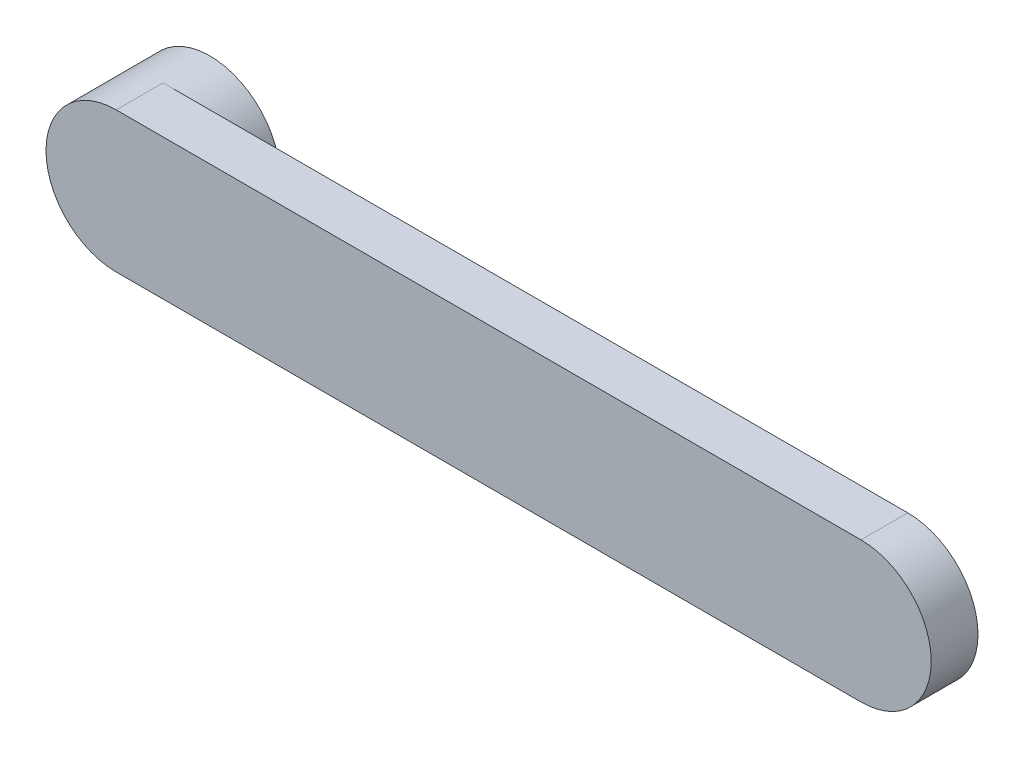
ISO-10303-21;
HEADER;
FILE_DESCRIPTION(('STEP AP214'),'2;1');
FILE_NAME('part.step','',(''),(''),'','','');
FILE_SCHEMA(('AUTOMOTIVE_DESIGN { 1 0 10303 214 1 1 1 1 }'));
ENDSEC;
DATA;
#1=APPLICATION_CONTEXT('core data for automotive mechanical design processes');
#2=APPLICATION_PROTOCOL_DEFINITION('international standard','automotive_design',2000,#1);
#3=PRODUCT_CONTEXT('',#1,'mechanical');
#4=PRODUCT('Part','Part','',(#3));
#5=PRODUCT_RELATED_PRODUCT_CATEGORY('part','',(#4));
#6=PRODUCT_DEFINITION_FORMATION('','',#4);
#7=PRODUCT_DEFINITION_CONTEXT('part definition',#1,'design');
#8=PRODUCT_DEFINITION('design','',#6,#7);
#9=PRODUCT_DEFINITION_SHAPE('','',#8);
#10=(LENGTH_UNIT() NAMED_UNIT(*) SI_UNIT(.MILLI.,.METRE.));
#11=(NAMED_UNIT(*) PLANE_ANGLE_UNIT() SI_UNIT($,.RADIAN.));
#12=(NAMED_UNIT(*) SI_UNIT($,.STERADIAN.) SOLID_ANGLE_UNIT());
#13=UNCERTAINTY_MEASURE_WITH_UNIT(LENGTH_MEASURE(1.E-05),#10,'distance_accuracy_value','');
#14=(GEOMETRIC_REPRESENTATION_CONTEXT(3) GLOBAL_UNCERTAINTY_ASSIGNED_CONTEXT((#13)) GLOBAL_UNIT_ASSIGNED_CONTEXT((#10,
#11,#12)) REPRESENTATION_CONTEXT('',''));
#15=CARTESIAN_POINT('',(0.,0.,0.));
#16=DIRECTION('',(0.,0.,1.));
#17=DIRECTION('',(1.,0.,0.));
#18=AXIS2_PLACEMENT_3D('',#15,#16,#17);
#19=CARTESIAN_POINT('',(-159.099025766973,0.,-10.));
#20=DIRECTION('',(0.,0.,1.));
#21=DIRECTION('',(1.,0.,0.));
#22=AXIS2_PLACEMENT_3D('',#19,#20,#21);
#23=CYLINDRICAL_SURFACE('',#22,30.);
#24=CARTESIAN_POINT('',(-159.099025766973,0.,10.));
#25=DIRECTION('',(0.,0.,1.));
#26=DIRECTION('',(1.,0.,0.));
#27=AXIS2_PLACEMENT_3D('',#24,#25,#26);
#28=CIRCLE('',#27,30.);
#29=CARTESIAN_POINT('',(-159.099025766973,30.,10.));
#30=VERTEX_POINT('',#29);
#31=CARTESIAN_POINT('',(-159.099025766973,-30.,10.));
#32=VERTEX_POINT('',#31);
#33=EDGE_CURVE('E104',#30,#32,#28,.T.);
#34=ORIENTED_EDGE('',*,*,#33,.F.);
#35=DIRECTION('',(0.,0.,1.));
#36=VECTOR('',#35,1.);
#37=CARTESIAN_POINT('',(-159.099025766973,30.,-10.));
#38=LINE('',#37,#36);
#39=CARTESIAN_POINT('',(-159.099025766973,30.,-10.));
#40=VERTEX_POINT('',#39);
#41=EDGE_CURVE('E40',#40,#30,#38,.T.);
#42=ORIENTED_EDGE('',*,*,#41,.F.);
#43=CARTESIAN_POINT('',(-159.099025766973,0.,-10.));
#44=DIRECTION('',(0.,0.,1.));
#45=DIRECTION('',(1.,0.,0.));
#46=AXIS2_PLACEMENT_3D('',#43,#44,#45);
#47=CIRCLE('',#46,30.);
#48=CARTESIAN_POINT('',(-159.099025766973,-30.,-10.));
#49=VERTEX_POINT('',#48);
#50=EDGE_CURVE('E11',#49,#40,#47,.T.);
#51=ORIENTED_EDGE('',*,*,#50,.F.);
#52=DIRECTION('',(0.,0.,1.));
#53=VECTOR('',#52,1.);
#54=CARTESIAN_POINT('',(-159.099025766973,-30.,-10.));
#55=LINE('',#54,#53);
#56=EDGE_CURVE('E74',#49,#32,#55,.T.);
#57=ORIENTED_EDGE('',*,*,#56,.T.);
#58=EDGE_LOOP('',(#34,#42,#51,#57));
#59=FACE_BOUND('',#58,.T.);
#60=CARTESIAN_POINT('',(-159.099025766973,0.,-30.));
#61=DIRECTION('',(0.,0.,1.));
#62=DIRECTION('',(1.,0.,0.));
#63=AXIS2_PLACEMENT_3D('',#60,#61,#62);
#64=CIRCLE('',#63,30.);
#65=CARTESIAN_POINT('',(-129.099025766973,0.,-30.));
#66=VERTEX_POINT('',#65);
#67=EDGE_CURVE('E109',#66,#66,#64,.T.);
#68=ORIENTED_EDGE('',*,*,#67,.T.);
#69=EDGE_LOOP('',(#68));
#70=FACE_BOUND('',#69,.T.);
#71=ADVANCED_FACE('F33',(#59,#70),#23,.T.);
#72=CARTESIAN_POINT('',(159.099025766973,30.,-10.));
#73=DIRECTION('',(0.,1.,0.));
#74=DIRECTION('',(0.,0.,1.));
#75=AXIS2_PLACEMENT_3D('',#72,#73,#74);
#76=PLANE('',#75);
#77=ORIENTED_EDGE('',*,*,#41,.T.);
#78=DIRECTION('',(-1.,0.,0.));
#79=VECTOR('',#78,1.);
#80=CARTESIAN_POINT('',(159.099025766973,30.,10.));
#81=LINE('',#80,#79);
#82=CARTESIAN_POINT('',(159.099025766973,30.,10.));
#83=VERTEX_POINT('',#82);
#84=EDGE_CURVE('E88',#83,#30,#81,.T.);
#85=ORIENTED_EDGE('',*,*,#84,.F.);
#86=DIRECTION('',(0.,0.,1.));
#87=VECTOR('',#86,1.);
#88=CARTESIAN_POINT('',(159.099025766973,30.,-10.));
#89=LINE('',#88,#87);
#90=CARTESIAN_POINT('',(159.099025766973,30.,-10.));
#91=VERTEX_POINT('',#90);
#92=EDGE_CURVE('E53',#91,#83,#89,.T.);
#93=ORIENTED_EDGE('',*,*,#92,.F.);
#94=DIRECTION('',(-1.,0.,0.));
#95=VECTOR('',#94,1.);
#96=CARTESIAN_POINT('',(159.099025766973,30.,-10.));
#97=LINE('',#96,#95);
#98=EDGE_CURVE('E84',#91,#40,#97,.T.);
#99=ORIENTED_EDGE('',*,*,#98,.T.);
#100=EDGE_LOOP('',(#77,#85,#93,#99));
#101=FACE_BOUND('',#100,.T.);
#102=ADVANCED_FACE('F121',(#101),#76,.T.);
#103=CARTESIAN_POINT('',(159.099025766973,0.,-10.));
#104=DIRECTION('',(0.,0.,1.));
#105=DIRECTION('',(1.,0.,0.));
#106=AXIS2_PLACEMENT_3D('',#103,#104,#105);
#107=CYLINDRICAL_SURFACE('',#106,30.);
#108=ORIENTED_EDGE('',*,*,#92,.T.);
#109=CARTESIAN_POINT('',(159.099025766973,0.,10.));
#110=DIRECTION('',(0.,0.,1.));
#111=DIRECTION('',(-1.,0.,0.));
#112=AXIS2_PLACEMENT_3D('',#109,#110,#111);
#113=CIRCLE('',#112,30.);
#114=CARTESIAN_POINT('',(159.099025766973,-30.,10.));
#115=VERTEX_POINT('',#114);
#116=EDGE_CURVE('E92',#115,#83,#113,.T.);
#117=ORIENTED_EDGE('',*,*,#116,.F.);
#118=DIRECTION('',(0.,0.,1.));
#119=VECTOR('',#118,1.);
#120=CARTESIAN_POINT('',(159.099025766973,-30.,-10.));
#121=LINE('',#120,#119);
#122=CARTESIAN_POINT('',(159.099025766973,-30.,-10.));
#123=VERTEX_POINT('',#122);
#124=EDGE_CURVE('E83',#123,#115,#121,.T.);
#125=ORIENTED_EDGE('',*,*,#124,.F.);
#126=CARTESIAN_POINT('',(159.099025766973,0.,-10.));
#127=DIRECTION('',(0.,0.,1.));
#128=DIRECTION('',(-1.,0.,0.));
#129=AXIS2_PLACEMENT_3D('',#126,#127,#128);
#130=CIRCLE('',#129,30.);
#131=EDGE_CURVE('E87',#123,#91,#130,.T.);
#132=ORIENTED_EDGE('',*,*,#131,.T.);
#133=EDGE_LOOP('',(#108,#117,#125,#132));
#134=FACE_BOUND('',#133,.T.);
#135=ADVANCED_FACE('F106',(#134),#107,.T.);
#136=CARTESIAN_POINT('',(-159.099025766973,-30.,-10.));
#137=DIRECTION('',(0.,-1.,0.));
#138=DIRECTION('',(0.,0.,-1.));
#139=AXIS2_PLACEMENT_3D('',#136,#137,#138);
#140=PLANE('',#139);
#141=ORIENTED_EDGE('',*,*,#124,.T.);
#142=DIRECTION('',(1.,0.,0.));
#143=VECTOR('',#142,1.);
#144=CARTESIAN_POINT('',(-159.099025766973,-30.,10.));
#145=LINE('',#144,#143);
#146=EDGE_CURVE('E81',#32,#115,#145,.T.);
#147=ORIENTED_EDGE('',*,*,#146,.F.);
#148=ORIENTED_EDGE('',*,*,#56,.F.);
#149=DIRECTION('',(1.,0.,0.));
#150=VECTOR('',#149,1.);
#151=CARTESIAN_POINT('',(-159.099025766973,-30.,-10.));
#152=LINE('',#151,#150);
#153=EDGE_CURVE('E79',#49,#123,#152,.T.);
#154=ORIENTED_EDGE('',*,*,#153,.T.);
#155=EDGE_LOOP('',(#141,#147,#148,#154));
#156=FACE_BOUND('',#155,.T.);
#157=ADVANCED_FACE('F78',(#156),#140,.T.);
#158=CARTESIAN_POINT('',(-159.099025766973,0.,-10.));
#159=DIRECTION('',(0.,0.,1.));
#160=DIRECTION('',(1.,0.,0.));
#161=AXIS2_PLACEMENT_3D('',#158,#159,#160);
#162=PLANE('',#161);
#163=ORIENTED_EDGE('',*,*,#153,.F.);
#164=ORIENTED_EDGE('',*,*,#50,.T.);
#165=ORIENTED_EDGE('',*,*,#98,.F.);
#166=ORIENTED_EDGE('',*,*,#131,.F.);
#167=EDGE_LOOP('',(#163,#164,#165,#166));
#168=FACE_BOUND('',#167,.T.);
#169=ADVANCED_FACE('F86',(#168),#162,.F.);
#170=CARTESIAN_POINT('',(-159.099025766973,0.,10.));
#171=DIRECTION('',(0.,0.,1.));
#172=DIRECTION('',(1.,0.,0.));
#173=AXIS2_PLACEMENT_3D('',#170,#171,#172);
#174=PLANE('',#173);
#175=ORIENTED_EDGE('',*,*,#33,.T.);
#176=ORIENTED_EDGE('',*,*,#146,.T.);
#177=ORIENTED_EDGE('',*,*,#116,.T.);
#178=ORIENTED_EDGE('',*,*,#84,.T.);
#179=EDGE_LOOP('',(#175,#176,#177,#178));
#180=FACE_BOUND('',#179,.T.);
#181=ADVANCED_FACE('F103',(#180),#174,.T.);
#182=CARTESIAN_POINT('',(-159.099025766973,0.,-30.));
#183=DIRECTION('',(0.,0.,1.));
#184=DIRECTION('',(1.,0.,0.));
#185=AXIS2_PLACEMENT_3D('',#182,#183,#184);
#186=PLANE('',#185);
#187=ORIENTED_EDGE('',*,*,#67,.F.);
#188=EDGE_LOOP('',(#187));
#189=FACE_BOUND('',#188,.T.);
#190=ADVANCED_FACE('F113',(#189),#186,.F.);
#191=CLOSED_SHELL('',(#71,#102,#135,#157,#169,#181,#190));
#192=MANIFOLD_SOLID_BREP('B2',#191);
#193=ADVANCED_BREP_SHAPE_REPRESENTATION('',(#18,#192),#14);
#194=SHAPE_DEFINITION_REPRESENTATION(#9,#193);
ENDSEC;
END-ISO-10303-21;
